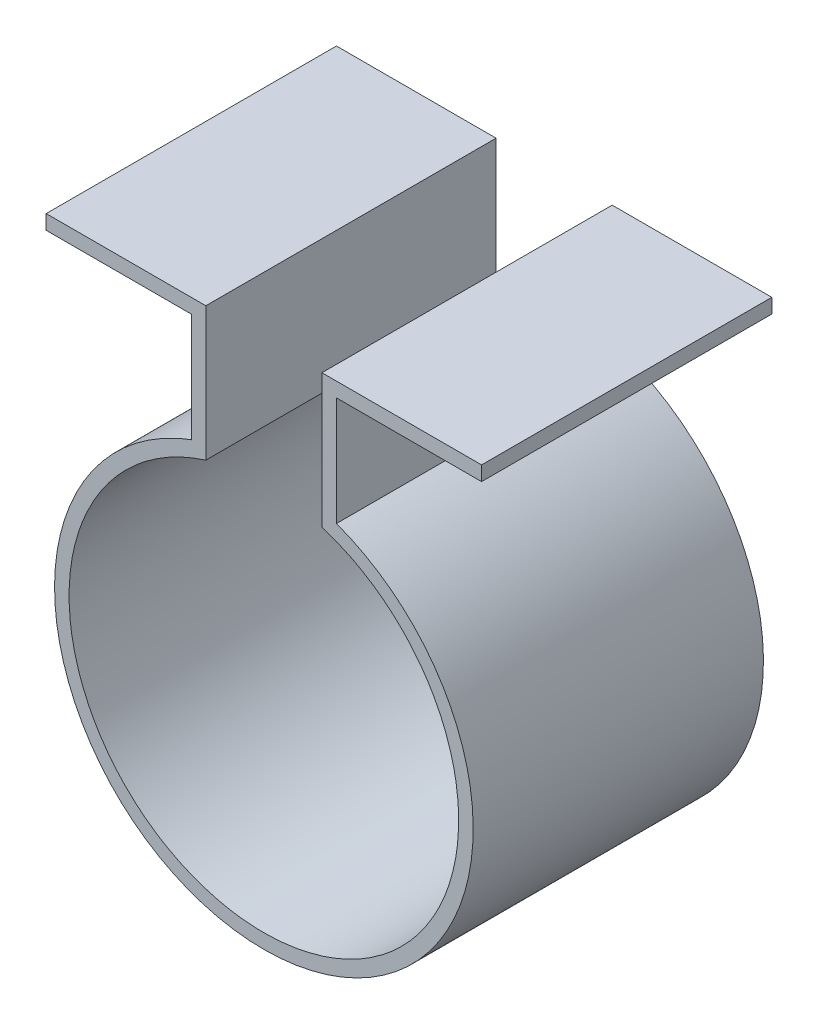
ISO-10303-21;
HEADER;
FILE_DESCRIPTION(('STEP AP214'),'2;1');
FILE_NAME('part.step','',(''),(''),'','','');
FILE_SCHEMA(('AUTOMOTIVE_DESIGN { 1 0 10303 214 1 1 1 1 }'));
ENDSEC;
DATA;
#1=APPLICATION_CONTEXT('core data for automotive mechanical design processes');
#2=APPLICATION_PROTOCOL_DEFINITION('international standard','automotive_design',2000,#1);
#3=PRODUCT_CONTEXT('',#1,'mechanical');
#4=PRODUCT('Part','Part','',(#3));
#5=PRODUCT_RELATED_PRODUCT_CATEGORY('part','',(#4));
#6=PRODUCT_DEFINITION_FORMATION('','',#4);
#7=PRODUCT_DEFINITION_CONTEXT('part definition',#1,'design');
#8=PRODUCT_DEFINITION('design','',#6,#7);
#9=PRODUCT_DEFINITION_SHAPE('','',#8);
#10=(LENGTH_UNIT() NAMED_UNIT(*) SI_UNIT(.MILLI.,.METRE.));
#11=(NAMED_UNIT(*) PLANE_ANGLE_UNIT() SI_UNIT($,.RADIAN.));
#12=(NAMED_UNIT(*) SI_UNIT($,.STERADIAN.) SOLID_ANGLE_UNIT());
#13=UNCERTAINTY_MEASURE_WITH_UNIT(LENGTH_MEASURE(1.E-05),#10,'distance_accuracy_value','');
#14=(GEOMETRIC_REPRESENTATION_CONTEXT(3) GLOBAL_UNCERTAINTY_ASSIGNED_CONTEXT((#13)) GLOBAL_UNIT_ASSIGNED_CONTEXT((#10,
#11,#12)) REPRESENTATION_CONTEXT('',''));
#15=CARTESIAN_POINT('',(0.,0.,0.));
#16=DIRECTION('',(0.,0.,1.));
#17=DIRECTION('',(1.,0.,0.));
#18=AXIS2_PLACEMENT_3D('',#15,#16,#17);
#19=CARTESIAN_POINT('',(-21.2549282949632,21.1669225073703,50.8));
#20=DIRECTION('',(0.,-1.,0.));
#21=DIRECTION('',(1.,0.,0.));
#22=AXIS2_PLACEMENT_3D('',#19,#20,#21);
#23=PLANE('',#22);
#24=DIRECTION('',(-1.,0.,0.));
#25=VECTOR('',#24,1.);
#26=CARTESIAN_POINT('',(-21.2549282949632,21.1669225073703,0.));
#27=LINE('',#26,#25);
#28=CARTESIAN_POINT('',(-18.7149282949632,21.1669225073703,0.));
#29=VERTEX_POINT('',#28);
#30=CARTESIAN_POINT('',(-46.6549282949631,21.1669225073703,0.));
#31=VERTEX_POINT('',#30);
#32=EDGE_CURVE('E244',#29,#31,#27,.T.);
#33=ORIENTED_EDGE('',*,*,#32,.T.);
#34=DIRECTION('',(0.,0.,-1.));
#35=VECTOR('',#34,1.);
#36=CARTESIAN_POINT('',(-46.6549282949631,21.1669225073703,50.8));
#37=LINE('',#36,#35);
#38=CARTESIAN_POINT('',(-46.6549282949631,21.1669225073703,50.8));
#39=VERTEX_POINT('',#38);
#40=EDGE_CURVE('E11',#39,#31,#37,.T.);
#41=ORIENTED_EDGE('',*,*,#40,.F.);
#42=DIRECTION('',(-1.,0.,0.));
#43=VECTOR('',#42,1.);
#44=CARTESIAN_POINT('',(-21.2549282949632,21.1669225073703,50.8));
#45=LINE('',#44,#43);
#46=CARTESIAN_POINT('',(-18.7149282949632,21.1669225073703,50.8));
#47=VERTEX_POINT('',#46);
#48=EDGE_CURVE('E100',#47,#39,#45,.T.);
#49=ORIENTED_EDGE('',*,*,#48,.F.);
#50=DIRECTION('',(0.,0.,-1.));
#51=VECTOR('',#50,1.);
#52=CARTESIAN_POINT('',(-18.7149282949632,21.1669225073703,50.8));
#53=LINE('',#52,#51);
#54=EDGE_CURVE('E148',#47,#29,#53,.T.);
#55=ORIENTED_EDGE('',*,*,#54,.T.);
#56=EDGE_LOOP('',(#33,#41,#49,#55));
#57=FACE_BOUND('',#56,.T.);
#58=ADVANCED_FACE('F32',(#57),#23,.F.);
#59=CARTESIAN_POINT('',(-46.6549282949631,18.6269225073703,50.8));
#60=DIRECTION('',(-1.,0.,0.));
#61=DIRECTION('',(0.,0.,1.));
#62=AXIS2_PLACEMENT_3D('',#59,#60,#61);
#63=PLANE('',#62);
#64=DIRECTION('',(0.,1.,0.));
#65=VECTOR('',#64,1.);
#66=CARTESIAN_POINT('',(-46.6549282949631,18.6269225073703,0.));
#67=LINE('',#66,#65);
#68=CARTESIAN_POINT('',(-46.6549282949631,18.6269225073703,0.));
#69=VERTEX_POINT('',#68);
#70=EDGE_CURVE('E239',#69,#31,#67,.T.);
#71=ORIENTED_EDGE('',*,*,#70,.F.);
#72=DIRECTION('',(0.,0.,-1.));
#73=VECTOR('',#72,1.);
#74=CARTESIAN_POINT('',(-46.6549282949631,18.6269225073703,50.8));
#75=LINE('',#74,#73);
#76=CARTESIAN_POINT('',(-46.6549282949631,18.6269225073703,50.8));
#77=VERTEX_POINT('',#76);
#78=EDGE_CURVE('E40',#77,#69,#75,.T.);
#79=ORIENTED_EDGE('',*,*,#78,.F.);
#80=DIRECTION('',(0.,1.,0.));
#81=VECTOR('',#80,1.);
#82=CARTESIAN_POINT('',(-46.6549282949631,18.6269225073703,50.8));
#83=LINE('',#82,#81);
#84=EDGE_CURVE('E295',#77,#39,#83,.T.);
#85=ORIENTED_EDGE('',*,*,#84,.T.);
#86=ORIENTED_EDGE('',*,*,#40,.T.);
#87=EDGE_LOOP('',(#71,#79,#85,#86));
#88=FACE_BOUND('',#87,.T.);
#89=ADVANCED_FACE('F240',(#88),#63,.T.);
#90=CARTESIAN_POINT('',(-21.2549282949632,18.6269225073703,50.8));
#91=DIRECTION('',(0.,-1.,0.));
#92=DIRECTION('',(1.,0.,0.));
#93=AXIS2_PLACEMENT_3D('',#90,#91,#92);
#94=PLANE('',#93);
#95=DIRECTION('',(-1.,0.,0.));
#96=VECTOR('',#95,1.);
#97=CARTESIAN_POINT('',(-21.2549282949632,18.6269225073703,0.));
#98=LINE('',#97,#96);
#99=CARTESIAN_POINT('',(-21.2549282949632,18.6269225073703,0.));
#100=VERTEX_POINT('',#99);
#101=EDGE_CURVE('E232',#100,#69,#98,.T.);
#102=ORIENTED_EDGE('',*,*,#101,.F.);
#103=DIRECTION('',(0.,0.,-1.));
#104=VECTOR('',#103,1.);
#105=CARTESIAN_POINT('',(-21.2549282949632,18.6269225073703,50.8));
#106=LINE('',#105,#104);
#107=CARTESIAN_POINT('',(-21.2549282949632,18.6269225073703,50.8));
#108=VERTEX_POINT('',#107);
#109=EDGE_CURVE('E225',#108,#100,#106,.T.);
#110=ORIENTED_EDGE('',*,*,#109,.F.);
#111=DIRECTION('',(-1.,0.,0.));
#112=VECTOR('',#111,1.);
#113=CARTESIAN_POINT('',(-21.2549282949632,18.6269225073703,50.8));
#114=LINE('',#113,#112);
#115=EDGE_CURVE('E235',#108,#77,#114,.T.);
#116=ORIENTED_EDGE('',*,*,#115,.T.);
#117=ORIENTED_EDGE('',*,*,#78,.T.);
#118=EDGE_LOOP('',(#102,#110,#116,#117));
#119=FACE_BOUND('',#118,.T.);
#120=ADVANCED_FACE('F230',(#119),#94,.T.);
#121=CARTESIAN_POINT('',(-21.2549282949632,-0.423077492629674,50.8));
#122=DIRECTION('',(-1.,0.,0.));
#123=DIRECTION('',(0.,-1.,0.));
#124=AXIS2_PLACEMENT_3D('',#121,#122,#123);
#125=PLANE('',#124);
#126=DIRECTION('',(0.,1.,0.));
#127=VECTOR('',#126,1.);
#128=CARTESIAN_POINT('',(-21.2549282949632,-0.423077492629674,0.));
#129=LINE('',#128,#127);
#130=CARTESIAN_POINT('',(-21.2549282949632,-0.423077492629674,0.));
#131=VERTEX_POINT('',#130);
#132=EDGE_CURVE('E249',#131,#100,#129,.T.);
#133=ORIENTED_EDGE('',*,*,#132,.F.);
#134=DIRECTION('',(0.,0.,-1.));
#135=VECTOR('',#134,1.);
#136=CARTESIAN_POINT('',(-21.2549282949632,-0.423077492629674,50.8));
#137=LINE('',#136,#135);
#138=CARTESIAN_POINT('',(-21.2549282949632,-0.423077492629674,50.8));
#139=VERTEX_POINT('',#138);
#140=EDGE_CURVE('E223',#139,#131,#137,.T.);
#141=ORIENTED_EDGE('',*,*,#140,.F.);
#142=DIRECTION('',(0.,1.,0.));
#143=VECTOR('',#142,1.);
#144=CARTESIAN_POINT('',(-21.2549282949632,-0.423077492629674,50.8));
#145=LINE('',#144,#143);
#146=EDGE_CURVE('E195',#139,#108,#145,.T.);
#147=ORIENTED_EDGE('',*,*,#146,.T.);
#148=ORIENTED_EDGE('',*,*,#109,.T.);
#149=EDGE_LOOP('',(#133,#141,#147,#148));
#150=FACE_BOUND('',#149,.T.);
#151=ADVANCED_FACE('F186',(#150),#125,.T.);
#152=CARTESIAN_POINT('',(-8.5549282949631,-34.7383364089282,50.8));
#153=DIRECTION('',(0.,0.,-1.));
#154=DIRECTION('',(0.992395063280253,0.123093616312878,0.));
#155=AXIS2_PLACEMENT_3D('',#152,#153,#154);
#156=ELLIPSE('',#155,36.6361354193027,36.5874356570666);
#157=DIRECTION('',(0.,0.,-1.));
#158=VECTOR('',#157,1.);
#159=SURFACE_OF_LINEAR_EXTRUSION('',#156,#158);
#160=CARTESIAN_POINT('',(-8.5549282949631,-34.7383364089282,0.));
#161=DIRECTION('',(0.,0.,-1.));
#162=DIRECTION('',(0.992395063280253,0.123093616312878,0.));
#163=AXIS2_PLACEMENT_3D('',#160,#161,#162);
#164=ELLIPSE('',#163,36.6361354193027,36.5874356570666);
#165=CARTESIAN_POINT('',(4.14507170503681,-0.414833648706835,0.));
#166=VERTEX_POINT('',#165);
#167=EDGE_CURVE('E251',#166,#131,#164,.T.);
#168=ORIENTED_EDGE('',*,*,#167,.F.);
#169=DIRECTION('',(0.,0.,-1.));
#170=VECTOR('',#169,1.);
#171=CARTESIAN_POINT('',(4.14507170503681,-0.414833648706835,50.8));
#172=LINE('',#171,#170);
#173=CARTESIAN_POINT('',(4.14507170503681,-0.414833648706835,50.8));
#174=VERTEX_POINT('',#173);
#175=EDGE_CURVE('E217',#174,#166,#172,.T.);
#176=ORIENTED_EDGE('',*,*,#175,.F.);
#177=EDGE_CURVE('E189',#174,#139,#156,.T.);
#178=ORIENTED_EDGE('',*,*,#177,.T.);
#179=ORIENTED_EDGE('',*,*,#140,.T.);
#180=EDGE_LOOP('',(#168,#176,#178,#179));
#181=FACE_BOUND('',#180,.T.);
#182=ADVANCED_FACE('F181',(#181),#159,.T.);
#183=CARTESIAN_POINT('',(4.14507170503681,-0.414833648706835,50.8));
#184=DIRECTION('',(1.,0.,0.));
#185=DIRECTION('',(0.,1.,0.));
#186=AXIS2_PLACEMENT_3D('',#183,#184,#185);
#187=PLANE('',#186);
#188=DIRECTION('',(0.,-1.,0.));
#189=VECTOR('',#188,1.);
#190=CARTESIAN_POINT('',(4.14507170503681,-0.414833648706835,0.));
#191=LINE('',#190,#189);
#192=CARTESIAN_POINT('',(4.14507170503681,18.6351663512932,0.));
#193=VERTEX_POINT('',#192);
#194=EDGE_CURVE('E255',#193,#166,#191,.T.);
#195=ORIENTED_EDGE('',*,*,#194,.F.);
#196=DIRECTION('',(0.,0.,-1.));
#197=VECTOR('',#196,1.);
#198=CARTESIAN_POINT('',(4.14507170503681,18.6351663512932,50.8));
#199=LINE('',#198,#197);
#200=CARTESIAN_POINT('',(4.14507170503681,18.6351663512932,50.8));
#201=VERTEX_POINT('',#200);
#202=EDGE_CURVE('E211',#201,#193,#199,.T.);
#203=ORIENTED_EDGE('',*,*,#202,.F.);
#204=DIRECTION('',(0.,-1.,0.));
#205=VECTOR('',#204,1.);
#206=CARTESIAN_POINT('',(4.14507170503681,-0.414833648706835,50.8));
#207=LINE('',#206,#205);
#208=EDGE_CURVE('E194',#201,#174,#207,.T.);
#209=ORIENTED_EDGE('',*,*,#208,.T.);
#210=ORIENTED_EDGE('',*,*,#175,.T.);
#211=EDGE_LOOP('',(#195,#203,#209,#210));
#212=FACE_BOUND('',#211,.T.);
#213=ADVANCED_FACE('F177',(#212),#187,.T.);
#214=CARTESIAN_POINT('',(4.14507170503681,18.6351663512932,50.8));
#215=DIRECTION('',(0.,-1.,0.));
#216=DIRECTION('',(0.,0.,-1.));
#217=AXIS2_PLACEMENT_3D('',#214,#215,#216);
#218=PLANE('',#217);
#219=DIRECTION('',(-1.,0.,0.));
#220=VECTOR('',#219,1.);
#221=CARTESIAN_POINT('',(4.14507170503681,18.6351663512932,0.));
#222=LINE('',#221,#220);
#223=CARTESIAN_POINT('',(29.5450717050368,18.6351663512932,0.));
#224=VERTEX_POINT('',#223);
#225=EDGE_CURVE('E214',#224,#193,#222,.T.);
#226=ORIENTED_EDGE('',*,*,#225,.F.);
#227=DIRECTION('',(0.,0.,-1.));
#228=VECTOR('',#227,1.);
#229=CARTESIAN_POINT('',(29.5450717050368,18.6351663512932,50.8));
#230=LINE('',#229,#228);
#231=CARTESIAN_POINT('',(29.5450717050368,18.6351663512932,50.8));
#232=VERTEX_POINT('',#231);
#233=EDGE_CURVE('E205',#232,#224,#230,.T.);
#234=ORIENTED_EDGE('',*,*,#233,.F.);
#235=DIRECTION('',(-1.,0.,0.));
#236=VECTOR('',#235,1.);
#237=CARTESIAN_POINT('',(4.14507170503681,18.6351663512932,50.8));
#238=LINE('',#237,#236);
#239=EDGE_CURVE('E199',#232,#201,#238,.T.);
#240=ORIENTED_EDGE('',*,*,#239,.T.);
#241=ORIENTED_EDGE('',*,*,#202,.T.);
#242=EDGE_LOOP('',(#226,#234,#240,#241));
#243=FACE_BOUND('',#242,.T.);
#244=ADVANCED_FACE('F173',(#243),#218,.T.);
#245=CARTESIAN_POINT('',(29.5450717050368,21.1751663512932,50.8));
#246=DIRECTION('',(1.,0.,0.));
#247=DIRECTION('',(0.,0.,-1.));
#248=AXIS2_PLACEMENT_3D('',#245,#246,#247);
#249=PLANE('',#248);
#250=DIRECTION('',(0.,-1.,0.));
#251=VECTOR('',#250,1.);
#252=CARTESIAN_POINT('',(29.5450717050368,21.1751663512932,0.));
#253=LINE('',#252,#251);
#254=CARTESIAN_POINT('',(29.5450717050368,21.1751663512932,0.));
#255=VERTEX_POINT('',#254);
#256=EDGE_CURVE('E259',#255,#224,#253,.T.);
#257=ORIENTED_EDGE('',*,*,#256,.F.);
#258=DIRECTION('',(0.,0.,-1.));
#259=VECTOR('',#258,1.);
#260=CARTESIAN_POINT('',(29.5450717050368,21.1751663512932,50.8));
#261=LINE('',#260,#259);
#262=CARTESIAN_POINT('',(29.5450717050368,21.1751663512932,50.8));
#263=VERTEX_POINT('',#262);
#264=EDGE_CURVE('E207',#263,#255,#261,.T.);
#265=ORIENTED_EDGE('',*,*,#264,.F.);
#266=DIRECTION('',(0.,-1.,0.));
#267=VECTOR('',#266,1.);
#268=CARTESIAN_POINT('',(29.5450717050368,21.1751663512932,50.8));
#269=LINE('',#268,#267);
#270=EDGE_CURVE('E202',#263,#232,#269,.T.);
#271=ORIENTED_EDGE('',*,*,#270,.T.);
#272=ORIENTED_EDGE('',*,*,#233,.T.);
#273=EDGE_LOOP('',(#257,#265,#271,#272));
#274=FACE_BOUND('',#273,.T.);
#275=ADVANCED_FACE('F169',(#274),#249,.T.);
#276=CARTESIAN_POINT('',(4.14507170503681,21.1751663512932,50.8));
#277=DIRECTION('',(0.,-1.,0.));
#278=DIRECTION('',(0.,0.,-1.));
#279=AXIS2_PLACEMENT_3D('',#276,#277,#278);
#280=PLANE('',#279);
#281=DIRECTION('',(1.,0.,0.));
#282=VECTOR('',#281,1.);
#283=CARTESIAN_POINT('',(4.14507170503681,21.1751663512932,0.));
#284=LINE('',#283,#282);
#285=CARTESIAN_POINT('',(1.60507170503681,21.1751663512932,0.));
#286=VERTEX_POINT('',#285);
#287=EDGE_CURVE('E261',#255,#286,#284,.F.);
#288=ORIENTED_EDGE('',*,*,#287,.T.);
#289=DIRECTION('',(0.,0.,-1.));
#290=VECTOR('',#289,1.);
#291=CARTESIAN_POINT('',(1.60507170503681,21.1751663512932,50.8));
#292=LINE('',#291,#290);
#293=CARTESIAN_POINT('',(1.60507170503681,21.1751663512932,50.8));
#294=VERTEX_POINT('',#293);
#295=EDGE_CURVE('E143',#294,#286,#292,.T.);
#296=ORIENTED_EDGE('',*,*,#295,.F.);
#297=DIRECTION('',(1.,0.,0.));
#298=VECTOR('',#297,1.);
#299=CARTESIAN_POINT('',(4.14507170503681,21.1751663512932,50.8));
#300=LINE('',#299,#298);
#301=EDGE_CURVE('E134',#263,#294,#300,.F.);
#302=ORIENTED_EDGE('',*,*,#301,.F.);
#303=ORIENTED_EDGE('',*,*,#264,.T.);
#304=EDGE_LOOP('',(#288,#296,#302,#303));
#305=FACE_BOUND('',#304,.T.);
#306=ADVANCED_FACE('F166',(#305),#280,.F.);
#307=CARTESIAN_POINT('',(1.60507170503681,-0.414833648706835,50.8));
#308=DIRECTION('',(1.,0.,0.));
#309=DIRECTION('',(0.,1.,0.));
#310=AXIS2_PLACEMENT_3D('',#307,#308,#309);
#311=PLANE('',#310);
#312=DIRECTION('',(0.,-1.,0.));
#313=VECTOR('',#312,1.);
#314=CARTESIAN_POINT('',(1.60507170503681,-0.414833648706835,0.));
#315=LINE('',#314,#313);
#316=CARTESIAN_POINT('',(1.60507170503679,-2.23343719918132,0.));
#317=VERTEX_POINT('',#316);
#318=EDGE_CURVE('E142',#286,#317,#315,.T.);
#319=ORIENTED_EDGE('',*,*,#318,.T.);
#320=DIRECTION('',(0.,0.,-1.));
#321=VECTOR('',#320,1.);
#322=CARTESIAN_POINT('',(1.60507170503679,-2.23343719918132,50.8));
#323=LINE('',#322,#321);
#324=CARTESIAN_POINT('',(1.60507170503679,-2.23343719918132,50.8));
#325=VERTEX_POINT('',#324);
#326=EDGE_CURVE('E139',#325,#317,#323,.T.);
#327=ORIENTED_EDGE('',*,*,#326,.F.);
#328=DIRECTION('',(0.,-1.,0.));
#329=VECTOR('',#328,1.);
#330=CARTESIAN_POINT('',(1.60507170503681,-0.414833648706835,50.8));
#331=LINE('',#330,#329);
#332=EDGE_CURVE('E127',#294,#325,#331,.T.);
#333=ORIENTED_EDGE('',*,*,#332,.F.);
#334=ORIENTED_EDGE('',*,*,#295,.T.);
#335=EDGE_LOOP('',(#319,#327,#333,#334));
#336=FACE_BOUND('',#335,.T.);
#337=ADVANCED_FACE('F140',(#336),#311,.F.);
#338=CARTESIAN_POINT('',(1.6050717050368,-2.23343719918132,50.8));
#339=CARTESIAN_POINT('',(3.53020826216928,-2.83290215153011,50.8));
#340=CARTESIAN_POINT('',(5.40182596145603,-3.60338667632,50.8));
#341=CARTESIAN_POINT('',(8.97936731046237,-5.46221345662985,50.8));
#342=CARTESIAN_POINT('',(10.6852319845642,-6.55052465967308,50.8));
#343=CARTESIAN_POINT('',(13.8777066535725,-9.01080376615698,50.8));
#344=CARTESIAN_POINT('',(15.364264216432,-10.3827307695441,50.8));
#345=CARTESIAN_POINT('',(18.0714652164543,-13.3671448981752,50.8));
#346=CARTESIAN_POINT('',(19.2920643544653,-14.9795826386161,50.8));
#347=CARTESIAN_POINT('',(21.4290471843414,-18.3943859833316,50.8));
#348=CARTESIAN_POINT('',(22.3453960113752,-20.1966953075814,50.8));
#349=CARTESIAN_POINT('',(23.8451273072412,-23.9346652794734,50.8));
#350=CARTESIAN_POINT('',(24.4284853429905,-25.8702645066583,50.8));
#351=CARTESIAN_POINT('',(25.2439276429985,-29.8140659884375,50.8));
#352=CARTESIAN_POINT('',(25.4759985955873,-31.822203550011,50.8));
#353=CARTESIAN_POINT('',(25.5815713990719,-35.8480607714263,50.8));
#354=CARTESIAN_POINT('',(25.4550714422319,-37.8657144049481,50.8));
#355=CARTESIAN_POINT('',(24.8474471772736,-41.847278663866,50.8));
#356=CARTESIAN_POINT('',(24.3663326389514,-43.8111239056364,50.8));
#357=CARTESIAN_POINT('',(23.0645445989925,-47.6234210248208,50.8));
#358=CARTESIAN_POINT('',(22.2438922021001,-49.4718101396878,50.8));
#359=CARTESIAN_POINT('',(20.2887500880492,-52.9951493430919,50.8));
#360=CARTESIAN_POINT('',(19.1542922408929,-54.6700412297659,50.8));
#361=CARTESIAN_POINT('',(16.6071199433328,-57.7937670281327,50.8));
#362=CARTESIAN_POINT('',(15.1944472228519,-59.2425491467809,50.8));
#363=CARTESIAN_POINT('',(12.1351770888418,-61.8685202325318,50.8));
#364=CARTESIAN_POINT('',(10.4886300261008,-63.0456655075717,50.8));
#365=CARTESIAN_POINT('',(7.01330791889405,-65.0913502327454,50.8));
#366=CARTESIAN_POINT('',(5.18459029303455,-65.9598555560896,50.8));
#367=CARTESIAN_POINT('',(1.40236564822198,-67.3609429790989,50.8));
#368=CARTESIAN_POINT('',(-0.551078709551948,-67.8935016822308,50.8));
#369=CARTESIAN_POINT('',(-4.52138494716724,-68.6059408385474,50.8));
#370=CARTESIAN_POINT('',(-6.53818095680544,-68.7858094293853,50.8));
#371=CARTESIAN_POINT('',(-10.5718214583334,-68.7872073703028,50.8));
#372=CARTESIAN_POINT('',(-12.5885990310012,-68.6087367914583,50.8));
#373=CARTESIAN_POINT('',(-16.5588368441286,-67.8990674683241,50.8));
#374=CARTESIAN_POINT('',(-18.5122313103851,-67.3678807034447,50.8));
#375=CARTESIAN_POINT('',(-22.2943393177266,-65.9694808840036,50.8));
#376=CARTESIAN_POINT('',(-24.1229903638702,-65.1022912745137,50.8));
#377=CARTESIAN_POINT('',(-27.5981824692836,-63.0591449481177,50.8));
#378=CARTESIAN_POINT('',(-29.2446663014245,-61.8832223132081,50.8));
#379=CARTESIAN_POINT('',(-32.3038329052368,-59.2595599187943,50.8));
#380=CARTESIAN_POINT('',(-33.7164654902873,-57.8118637144165,50.8));
#381=CARTESIAN_POINT('',(-36.2635944427315,-54.6901255491117,50.8));
#382=CARTESIAN_POINT('',(-37.3980491711287,-53.0161351800207,50.8));
#383=CARTESIAN_POINT('',(-39.3532261975534,-49.4943683678093,50.8));
#384=CARTESIAN_POINT('',(-40.1739166169666,-47.6466499089279,50.8));
#385=CARTESIAN_POINT('',(-41.4758149924306,-43.8354246501681,50.8));
#386=CARTESIAN_POINT('',(-41.9570017369654,-41.8719804338636,50.8));
#387=CARTESIAN_POINT('',(-42.5647885264028,-37.890923770572,50.8));
#388=CARTESIAN_POINT('',(-42.69137862592,-35.873376613657,50.8));
#389=CARTESIAN_POINT('',(-42.5859830966115,-31.8474309447526,50.8));
#390=CARTESIAN_POINT('',(-42.3539990803704,-29.8390984757939,50.8));
#391=CARTESIAN_POINT('',(-41.5387073397593,-25.8946181146732,50.8));
#392=CARTESIAN_POINT('',(-40.9554127673035,-23.9585350380511,50.8));
#393=CARTESIAN_POINT('',(-39.455771138829,-20.2193377853377,50.8));
#394=CARTESIAN_POINT('',(-38.5394484361868,-18.416285225605,50.8));
#395=CARTESIAN_POINT('',(-36.4024767548575,-14.9997775309851,50.8));
#396=CARTESIAN_POINT('',(-35.1818626629207,-13.3863788945972,50.8));
#397=CARTESIAN_POINT('',(-32.4745978429807,-10.3998725939809,50.8));
#398=CARTESIAN_POINT('',(-30.9879915304795,-9.02681450109099,50.8));
#399=CARTESIAN_POINT('',(-27.7954015376479,-6.56414984689522,50.8));
#400=CARTESIAN_POINT('',(-26.0894704669316,-5.47458429717273,50.8));
#401=CARTESIAN_POINT('',(-22.5117989276834,-3.61316735746297,50.8));
#402=CARTESIAN_POINT('',(-20.6401176241904,-2.8413470361032,50.8));
#403=CARTESIAN_POINT('',(-18.7149282949632,-2.24052296650801,50.8));
#404=B_SPLINE_CURVE_WITH_KNOTS('',3,(#338,#339,#340,#341,#342,#343,#344,#345,#346,#347,#348,
#349,#350,#351,#352,#353,#354,#355,#356,#357,#358,#359,#360,#361,#362,#363,#364,#365,#366,#367,
#368,#369,#370,#371,#372,#373,#374,#375,#376,#377,#378,#379,#380,#381,#382,#383,#384,#385,#386,
#387,#388,#389,#390,#391,#392,#393,#394,#395,#396,#397,#398,#399,#400,#401,#402,#403),
.UNSPECIFIED.,.F.,.F.,(4,2,2,2,2,2,2,2,2,2,2,2,2,2,2,2,2,2,2,2,2,2,2,2,2,2,2,2,2,2,2,2,4),(0.,
0.03125,0.0625,0.09375,0.125,0.15625,0.1875,0.21875,0.25,0.28125,0.3125,0.34375,0.375,0.40625,
0.4375,0.46875,0.5,0.53125,0.5625,0.59375,0.625,0.65625,0.6875,0.71875,0.75,0.78125,0.8125,
0.84375,0.875,0.90625,0.9375,0.96875,1.),.UNSPECIFIED.);
#405=DIRECTION('',(0.,0.,-1.));
#406=VECTOR('',#405,1.);
#407=SURFACE_OF_LINEAR_EXTRUSION('',#404,#406);
#408=CARTESIAN_POINT('',(1.6050717050368,-2.23343719918132,0.));
#409=CARTESIAN_POINT('',(3.53020826216928,-2.83290215153011,0.));
#410=CARTESIAN_POINT('',(5.40182596145603,-3.60338667632,0.));
#411=CARTESIAN_POINT('',(8.97936731046237,-5.46221345662985,0.));
#412=CARTESIAN_POINT('',(10.6852319845642,-6.55052465967308,0.));
#413=CARTESIAN_POINT('',(13.8777066535725,-9.01080376615698,0.));
#414=CARTESIAN_POINT('',(15.364264216432,-10.3827307695441,0.));
#415=CARTESIAN_POINT('',(18.0714652164543,-13.3671448981752,0.));
#416=CARTESIAN_POINT('',(19.2920643544653,-14.9795826386161,0.));
#417=CARTESIAN_POINT('',(21.4290471843414,-18.3943859833316,0.));
#418=CARTESIAN_POINT('',(22.3453960113752,-20.1966953075814,0.));
#419=CARTESIAN_POINT('',(23.8451273072412,-23.9346652794734,0.));
#420=CARTESIAN_POINT('',(24.4284853429905,-25.8702645066583,0.));
#421=CARTESIAN_POINT('',(25.2439276429985,-29.8140659884375,0.));
#422=CARTESIAN_POINT('',(25.4759985955873,-31.822203550011,0.));
#423=CARTESIAN_POINT('',(25.5815713990719,-35.8480607714263,0.));
#424=CARTESIAN_POINT('',(25.4550714422319,-37.8657144049481,0.));
#425=CARTESIAN_POINT('',(24.8474471772736,-41.847278663866,0.));
#426=CARTESIAN_POINT('',(24.3663326389514,-43.8111239056364,0.));
#427=CARTESIAN_POINT('',(23.0645445989925,-47.6234210248208,0.));
#428=CARTESIAN_POINT('',(22.2438922021001,-49.4718101396878,0.));
#429=CARTESIAN_POINT('',(20.2887500880492,-52.9951493430919,0.));
#430=CARTESIAN_POINT('',(19.1542922408929,-54.6700412297659,0.));
#431=CARTESIAN_POINT('',(16.6071199433328,-57.7937670281327,0.));
#432=CARTESIAN_POINT('',(15.1944472228519,-59.2425491467809,0.));
#433=CARTESIAN_POINT('',(12.1351770888418,-61.8685202325318,0.));
#434=CARTESIAN_POINT('',(10.4886300261008,-63.0456655075717,0.));
#435=CARTESIAN_POINT('',(7.01330791889405,-65.0913502327454,0.));
#436=CARTESIAN_POINT('',(5.18459029303455,-65.9598555560896,0.));
#437=CARTESIAN_POINT('',(1.40236564822198,-67.3609429790989,0.));
#438=CARTESIAN_POINT('',(-0.551078709551948,-67.8935016822308,0.));
#439=CARTESIAN_POINT('',(-4.52138494716724,-68.6059408385474,0.));
#440=CARTESIAN_POINT('',(-6.53818095680544,-68.7858094293853,0.));
#441=CARTESIAN_POINT('',(-10.5718214583334,-68.7872073703028,0.));
#442=CARTESIAN_POINT('',(-12.5885990310012,-68.6087367914583,0.));
#443=CARTESIAN_POINT('',(-16.5588368441286,-67.8990674683241,0.));
#444=CARTESIAN_POINT('',(-18.5122313103851,-67.3678807034447,0.));
#445=CARTESIAN_POINT('',(-22.2943393177266,-65.9694808840036,0.));
#446=CARTESIAN_POINT('',(-24.1229903638702,-65.1022912745137,0.));
#447=CARTESIAN_POINT('',(-27.5981824692836,-63.0591449481177,0.));
#448=CARTESIAN_POINT('',(-29.2446663014245,-61.8832223132081,0.));
#449=CARTESIAN_POINT('',(-32.3038329052368,-59.2595599187943,0.));
#450=CARTESIAN_POINT('',(-33.7164654902873,-57.8118637144165,0.));
#451=CARTESIAN_POINT('',(-36.2635944427315,-54.6901255491117,0.));
#452=CARTESIAN_POINT('',(-37.3980491711287,-53.0161351800207,0.));
#453=CARTESIAN_POINT('',(-39.3532261975534,-49.4943683678093,0.));
#454=CARTESIAN_POINT('',(-40.1739166169666,-47.6466499089279,0.));
#455=CARTESIAN_POINT('',(-41.4758149924306,-43.8354246501681,0.));
#456=CARTESIAN_POINT('',(-41.9570017369654,-41.8719804338636,0.));
#457=CARTESIAN_POINT('',(-42.5647885264028,-37.890923770572,0.));
#458=CARTESIAN_POINT('',(-42.69137862592,-35.873376613657,0.));
#459=CARTESIAN_POINT('',(-42.5859830966115,-31.8474309447526,0.));
#460=CARTESIAN_POINT('',(-42.3539990803704,-29.8390984757939,0.));
#461=CARTESIAN_POINT('',(-41.5387073397593,-25.8946181146732,0.));
#462=CARTESIAN_POINT('',(-40.9554127673035,-23.9585350380511,0.));
#463=CARTESIAN_POINT('',(-39.455771138829,-20.2193377853377,0.));
#464=CARTESIAN_POINT('',(-38.5394484361868,-18.416285225605,0.));
#465=CARTESIAN_POINT('',(-36.4024767548575,-14.9997775309851,0.));
#466=CARTESIAN_POINT('',(-35.1818626629207,-13.3863788945972,0.));
#467=CARTESIAN_POINT('',(-32.4745978429807,-10.3998725939809,0.));
#468=CARTESIAN_POINT('',(-30.9879915304795,-9.02681450109099,0.));
#469=CARTESIAN_POINT('',(-27.7954015376479,-6.56414984689522,0.));
#470=CARTESIAN_POINT('',(-26.0894704669316,-5.47458429717273,0.));
#471=CARTESIAN_POINT('',(-22.5117989276834,-3.61316735746297,0.));
#472=CARTESIAN_POINT('',(-20.6401176241904,-2.8413470361032,0.));
#473=CARTESIAN_POINT('',(-18.7149282949632,-2.24052296650801,0.));
#474=B_SPLINE_CURVE_WITH_KNOTS('',3,(#408,#409,#410,#411,#412,#413,#414,#415,#416,#417,#418,
#419,#420,#421,#422,#423,#424,#425,#426,#427,#428,#429,#430,#431,#432,#433,#434,#435,#436,#437,
#438,#439,#440,#441,#442,#443,#444,#445,#446,#447,#448,#449,#450,#451,#452,#453,#454,#455,#456,
#457,#458,#459,#460,#461,#462,#463,#464,#465,#466,#467,#468,#469,#470,#471,#472,#473),
.UNSPECIFIED.,.F.,.F.,(4,2,2,2,2,2,2,2,2,2,2,2,2,2,2,2,2,2,2,2,2,2,2,2,2,2,2,2,2,2,2,2,4),(0.,
0.03125,0.0625,0.09375,0.125,0.15625,0.1875,0.21875,0.25,0.28125,0.3125,0.34375,0.375,0.40625,
0.4375,0.46875,0.5,0.53125,0.5625,0.59375,0.625,0.65625,0.6875,0.71875,0.75,0.78125,0.8125,
0.84375,0.875,0.90625,0.9375,0.96875,1.),.UNSPECIFIED.);
#475=CARTESIAN_POINT('',(-18.7149282949632,-2.240522966508,0.));
#476=VERTEX_POINT('',#475);
#477=EDGE_CURVE('E88',#317,#476,#474,.T.);
#478=ORIENTED_EDGE('',*,*,#477,.T.);
#479=DIRECTION('',(0.,0.,-1.));
#480=VECTOR('',#479,1.);
#481=CARTESIAN_POINT('',(-18.7149282949632,-2.240522966508,50.8));
#482=LINE('',#481,#480);
#483=CARTESIAN_POINT('',(-18.7149282949632,-2.240522966508,50.8));
#484=VERTEX_POINT('',#483);
#485=EDGE_CURVE('E144',#484,#476,#482,.T.);
#486=ORIENTED_EDGE('',*,*,#485,.F.);
#487=EDGE_CURVE('E131',#325,#484,#404,.T.);
#488=ORIENTED_EDGE('',*,*,#487,.F.);
#489=ORIENTED_EDGE('',*,*,#326,.T.);
#490=EDGE_LOOP('',(#478,#486,#488,#489));
#491=FACE_BOUND('',#490,.T.);
#492=ADVANCED_FACE('F146',(#491),#407,.F.);
#493=CARTESIAN_POINT('',(-18.7149282949632,-0.423077492629675,50.8));
#494=DIRECTION('',(-1.,0.,0.));
#495=DIRECTION('',(0.,-1.,0.));
#496=AXIS2_PLACEMENT_3D('',#493,#494,#495);
#497=PLANE('',#496);
#498=DIRECTION('',(0.,1.,0.));
#499=VECTOR('',#498,1.);
#500=CARTESIAN_POINT('',(-18.7149282949632,-0.423077492629675,0.));
#501=LINE('',#500,#499);
#502=EDGE_CURVE('E94',#476,#29,#501,.T.);
#503=ORIENTED_EDGE('',*,*,#502,.T.);
#504=ORIENTED_EDGE('',*,*,#54,.F.);
#505=DIRECTION('',(0.,1.,0.));
#506=VECTOR('',#505,1.);
#507=CARTESIAN_POINT('',(-18.7149282949632,-0.423077492629675,50.8));
#508=LINE('',#507,#506);
#509=EDGE_CURVE('E48',#484,#47,#508,.T.);
#510=ORIENTED_EDGE('',*,*,#509,.F.);
#511=ORIENTED_EDGE('',*,*,#485,.T.);
#512=EDGE_LOOP('',(#503,#504,#510,#511));
#513=FACE_BOUND('',#512,.T.);
#514=ADVANCED_FACE('F162',(#513),#497,.F.);
#515=CARTESIAN_POINT('',(-8.5549282949631,-34.7383364089282,50.8));
#516=DIRECTION('',(0.,0.,-1.));
#517=DIRECTION('',(-1.,0.,0.));
#518=AXIS2_PLACEMENT_3D('',#515,#516,#517);
#519=PLANE('',#518);
#520=ORIENTED_EDGE('',*,*,#48,.T.);
#521=ORIENTED_EDGE('',*,*,#84,.F.);
#522=ORIENTED_EDGE('',*,*,#115,.F.);
#523=ORIENTED_EDGE('',*,*,#146,.F.);
#524=ORIENTED_EDGE('',*,*,#177,.F.);
#525=ORIENTED_EDGE('',*,*,#208,.F.);
#526=ORIENTED_EDGE('',*,*,#239,.F.);
#527=ORIENTED_EDGE('',*,*,#270,.F.);
#528=ORIENTED_EDGE('',*,*,#301,.T.);
#529=ORIENTED_EDGE('',*,*,#332,.T.);
#530=ORIENTED_EDGE('',*,*,#487,.T.);
#531=ORIENTED_EDGE('',*,*,#509,.T.);
#532=EDGE_LOOP('',(#520,#521,#522,#523,#524,#525,#526,#527,#528,#529,#530,#531));
#533=FACE_BOUND('',#532,.T.);
#534=ADVANCED_FACE('F129',(#533),#519,.F.);
#535=CARTESIAN_POINT('',(-8.5549282949631,-34.7383364089282,0.));
#536=DIRECTION('',(0.,0.,-1.));
#537=DIRECTION('',(-1.,0.,0.));
#538=AXIS2_PLACEMENT_3D('',#535,#536,#537);
#539=PLANE('',#538);
#540=ORIENTED_EDGE('',*,*,#32,.F.);
#541=ORIENTED_EDGE('',*,*,#502,.F.);
#542=ORIENTED_EDGE('',*,*,#477,.F.);
#543=ORIENTED_EDGE('',*,*,#318,.F.);
#544=ORIENTED_EDGE('',*,*,#287,.F.);
#545=ORIENTED_EDGE('',*,*,#256,.T.);
#546=ORIENTED_EDGE('',*,*,#225,.T.);
#547=ORIENTED_EDGE('',*,*,#194,.T.);
#548=ORIENTED_EDGE('',*,*,#167,.T.);
#549=ORIENTED_EDGE('',*,*,#132,.T.);
#550=ORIENTED_EDGE('',*,*,#101,.T.);
#551=ORIENTED_EDGE('',*,*,#70,.T.);
#552=EDGE_LOOP('',(#540,#541,#542,#543,#544,#545,#546,#547,#548,#549,#550,#551));
#553=FACE_BOUND('',#552,.T.);
#554=ADVANCED_FACE('F246',(#553),#539,.T.);
#555=CLOSED_SHELL('',(#58,#89,#120,#151,#182,#213,#244,#275,#306,#337,#492,#514,#534,#554));
#556=MANIFOLD_SOLID_BREP('B2',#555);
#557=ADVANCED_BREP_SHAPE_REPRESENTATION('',(#18,#556),#14);
#558=SHAPE_DEFINITION_REPRESENTATION(#9,#557);
ENDSEC;
END-ISO-10303-21;
